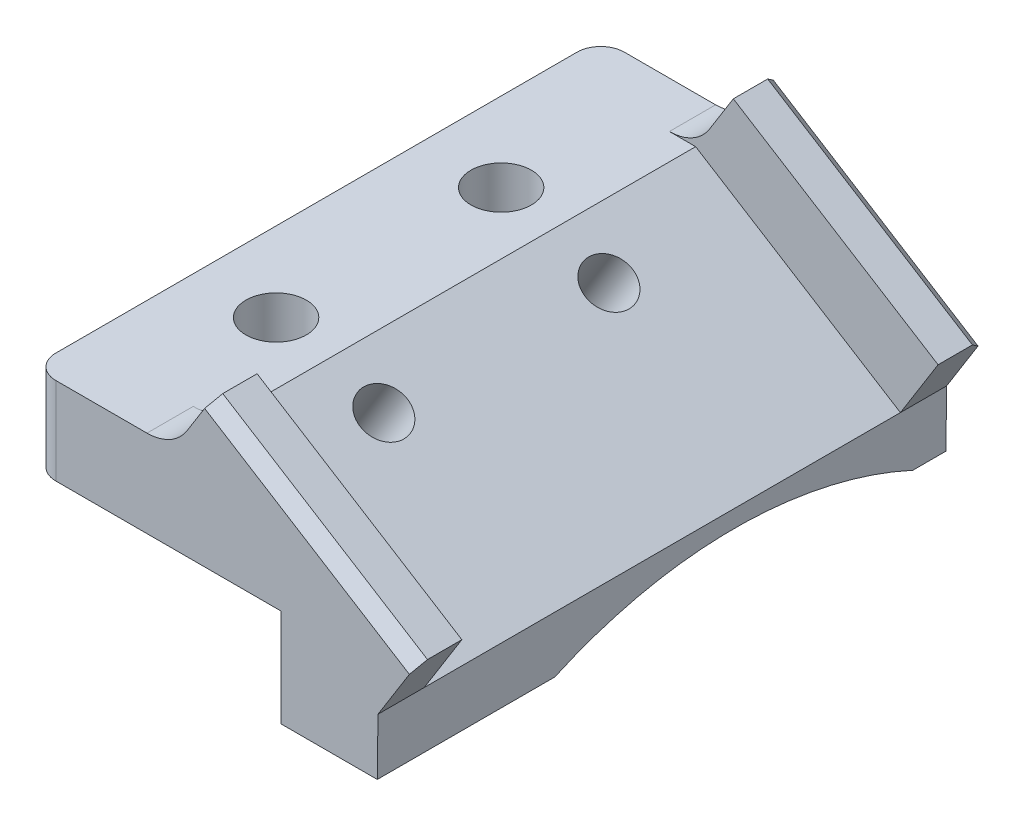
ISO-10303-21;
HEADER;
FILE_DESCRIPTION(('STEP AP214'),'2;1');
FILE_NAME('part.step','',(''),(''),'','','');
FILE_SCHEMA(('AUTOMOTIVE_DESIGN { 1 0 10303 214 1 1 1 1 }'));
ENDSEC;
DATA;
#1=APPLICATION_CONTEXT('core data for automotive mechanical design processes');
#2=APPLICATION_PROTOCOL_DEFINITION('international standard','automotive_design',2000,#1);
#3=PRODUCT_CONTEXT('',#1,'mechanical');
#4=PRODUCT('Part','Part','',(#3));
#5=PRODUCT_RELATED_PRODUCT_CATEGORY('part','',(#4));
#6=PRODUCT_DEFINITION_FORMATION('','',#4);
#7=PRODUCT_DEFINITION_CONTEXT('part definition',#1,'design');
#8=PRODUCT_DEFINITION('design','',#6,#7);
#9=PRODUCT_DEFINITION_SHAPE('','',#8);
#10=(LENGTH_UNIT() NAMED_UNIT(*) SI_UNIT(.MILLI.,.METRE.));
#11=(NAMED_UNIT(*) PLANE_ANGLE_UNIT() SI_UNIT($,.RADIAN.));
#12=(NAMED_UNIT(*) SI_UNIT($,.STERADIAN.) SOLID_ANGLE_UNIT());
#13=UNCERTAINTY_MEASURE_WITH_UNIT(LENGTH_MEASURE(1.E-05),#10,'distance_accuracy_value','');
#14=(GEOMETRIC_REPRESENTATION_CONTEXT(3) GLOBAL_UNCERTAINTY_ASSIGNED_CONTEXT((#13)) GLOBAL_UNIT_ASSIGNED_CONTEXT((#10,
#11,#12)) REPRESENTATION_CONTEXT('',''));
#15=CARTESIAN_POINT('',(0.,0.,0.));
#16=DIRECTION('',(0.,0.,1.));
#17=DIRECTION('',(1.,0.,0.));
#18=AXIS2_PLACEMENT_3D('',#15,#16,#17);
#19=CARTESIAN_POINT('',(-4.07097685037666,0.,24.));
#20=DIRECTION('',(0.,1.,0.));
#21=DIRECTION('',(0.,0.,1.));
#22=AXIS2_PLACEMENT_3D('',#19,#20,#21);
#23=PLANE('',#22);
#24=DIRECTION('',(0.,0.,-1.));
#25=VECTOR('',#24,1.);
#26=CARTESIAN_POINT('',(0.,0.,24.));
#27=LINE('',#26,#25);
#28=CARTESIAN_POINT('',(0.,0.,1.39553440509318));
#29=VERTEX_POINT('',#28);
#30=CARTESIAN_POINT('',(0.,0.,0.));
#31=VERTEX_POINT('',#30);
#32=EDGE_CURVE('E211',#29,#31,#27,.T.);
#33=ORIENTED_EDGE('',*,*,#32,.F.);
#34=CARTESIAN_POINT('',(-1337.31627510391,0.,8.94999999999999));
#35=DIRECTION('',(0.,1.,0.));
#36=DIRECTION('',(1.,0.,0.));
#37=AXIS2_PLACEMENT_3D('',#34,#35,#36);
#38=ELLIPSE('',#37,1473.35669717554,18.);
#39=CARTESIAN_POINT('',(-4.07097685037666,0.,1.28888903104086));
#40=VERTEX_POINT('',#39);
#41=EDGE_CURVE('E190',#29,#40,#38,.T.);
#42=ORIENTED_EDGE('',*,*,#41,.T.);
#43=DIRECTION('',(0.,0.,-1.));
#44=VECTOR('',#43,1.);
#45=CARTESIAN_POINT('',(-4.07097685037666,0.,24.));
#46=LINE('',#45,#44);
#47=CARTESIAN_POINT('',(-4.07097685037666,0.,0.));
#48=VERTEX_POINT('',#47);
#49=EDGE_CURVE('E335',#40,#48,#46,.T.);
#50=ORIENTED_EDGE('',*,*,#49,.T.);
#51=DIRECTION('',(1.,0.,0.));
#52=VECTOR('',#51,1.);
#53=CARTESIAN_POINT('',(-4.07097685037666,0.,0.));
#54=LINE('',#53,#52);
#55=EDGE_CURVE('E324',#48,#31,#54,.T.);
#56=ORIENTED_EDGE('',*,*,#55,.T.);
#57=EDGE_LOOP('',(#33,#42,#50,#56));
#58=FACE_BOUND('',#57,.T.);
#59=ADVANCED_FACE('F36',(#58),#23,.F.);
#60=CARTESIAN_POINT('',(0.0293229903893053,2.4,24.));
#61=DIRECTION('',(-0.529919264233203,-0.848048096156427,0.));
#62=DIRECTION('',(0.848048096156427,-0.529919264233203,0.));
#63=AXIS2_PLACEMENT_3D('',#60,#61,#62);
#64=PLANE('',#63);
#65=CARTESIAN_POINT('',(-6.67376729217509,6.5885556806557,17.05));
#66=DIRECTION('',(-0.529919264233203,-0.848048096156427,0.));
#67=DIRECTION('',(0.848048096156427,-0.529919264233203,0.));
#68=AXIS2_PLACEMENT_3D('',#65,#66,#67);
#69=CIRCLE('',#68,1.);
#70=CARTESIAN_POINT('',(-5.82571919601866,6.0586364164225,17.05));
#71=VERTEX_POINT('',#70);
#72=EDGE_CURVE('E270',#71,#71,#69,.T.);
#73=ORIENTED_EDGE('',*,*,#72,.T.);
#74=EDGE_LOOP('',(#73));
#75=FACE_BOUND('',#74,.T.);
#76=CARTESIAN_POINT('',(-6.67376729217509,6.58855568065571,7.54999999999999));
#77=DIRECTION('',(-0.529919264233203,-0.848048096156427,0.));
#78=DIRECTION('',(0.848048096156427,-0.529919264233203,0.));
#79=AXIS2_PLACEMENT_3D('',#76,#77,#78);
#80=CIRCLE('',#79,1.);
#81=CARTESIAN_POINT('',(-5.82571919601866,6.0586364164225,7.54999999999999));
#82=VERTEX_POINT('',#81);
#83=EDGE_CURVE('E266',#82,#82,#80,.T.);
#84=ORIENTED_EDGE('',*,*,#83,.T.);
#85=EDGE_LOOP('',(#84));
#86=FACE_BOUND('',#85,.T.);
#87=DIRECTION('',(-0.848048096156427,0.529919264233203,0.));
#88=VECTOR('',#87,1.);
#89=CARTESIAN_POINT('',(-8.6124834664324,7.79999999999999,22.05));
#90=LINE('',#89,#88);
#91=CARTESIAN_POINT('',(0.0293229903893053,2.4,22.05));
#92=VERTEX_POINT('',#91);
#93=CARTESIAN_POINT('',(-8.6124834664324,7.79999999999999,22.05));
#94=VERTEX_POINT('',#93);
#95=EDGE_CURVE('E373',#92,#94,#90,.T.);
#96=ORIENTED_EDGE('',*,*,#95,.F.);
#97=DIRECTION('',(0.,0.,-1.));
#98=VECTOR('',#97,1.);
#99=CARTESIAN_POINT('',(0.0293229903893053,2.4,24.));
#100=LINE('',#99,#98);
#101=CARTESIAN_POINT('',(0.0293229903893053,2.4,1.95));
#102=VERTEX_POINT('',#101);
#103=EDGE_CURVE('E355',#92,#102,#100,.T.);
#104=ORIENTED_EDGE('',*,*,#103,.T.);
#105=DIRECTION('',(0.848048096156427,-0.529919264233203,0.));
#106=VECTOR('',#105,1.);
#107=CARTESIAN_POINT('',(-8.6124834664324,7.8,1.95));
#108=LINE('',#107,#106);
#109=CARTESIAN_POINT('',(-8.6124834664324,7.8,1.95));
#110=VERTEX_POINT('',#109);
#111=EDGE_CURVE('E386',#110,#102,#108,.T.);
#112=ORIENTED_EDGE('',*,*,#111,.F.);
#113=DIRECTION('',(0.,0.,-1.));
#114=VECTOR('',#113,1.);
#115=CARTESIAN_POINT('',(-8.6124834664324,7.8,24.));
#116=LINE('',#115,#114);
#117=EDGE_CURVE('E295',#94,#110,#116,.T.);
#118=ORIENTED_EDGE('',*,*,#117,.F.);
#119=EDGE_LOOP('',(#96,#104,#112,#118));
#120=FACE_BOUND('',#119,.T.);
#121=ADVANCED_FACE('F378',(#75,#86,#120),#64,.F.);
#122=CARTESIAN_POINT('',(-4.07097685037666,0.,24.));
#123=VERTEX_POINT('',#122);
#124=CARTESIAN_POINT('',(-4.07097685037666,0.,16.6111109689591));
#125=VERTEX_POINT('',#124);
#126=EDGE_CURVE('E203',#123,#125,#46,.T.);
#127=ORIENTED_EDGE('',*,*,#126,.T.);
#128=CARTESIAN_POINT('',(0.,0.,16.5044655949068));
#129=VERTEX_POINT('',#128);
#130=EDGE_CURVE('E187',#125,#129,#38,.T.);
#131=ORIENTED_EDGE('',*,*,#130,.T.);
#132=CARTESIAN_POINT('',(0.,0.,24.));
#133=VERTEX_POINT('',#132);
#134=EDGE_CURVE('E201',#133,#129,#27,.T.);
#135=ORIENTED_EDGE('',*,*,#134,.F.);
#136=DIRECTION('',(1.,0.,0.));
#137=VECTOR('',#136,1.);
#138=CARTESIAN_POINT('',(-4.07097685037666,0.,24.));
#139=LINE('',#138,#137);
#140=EDGE_CURVE('E325',#123,#133,#139,.T.);
#141=ORIENTED_EDGE('',*,*,#140,.F.);
#142=EDGE_LOOP('',(#127,#131,#135,#141));
#143=FACE_BOUND('',#142,.T.);
#144=ADVANCED_FACE('F199',(#143),#23,.F.);
#145=CARTESIAN_POINT('',(0.,0.,24.));
#146=DIRECTION('',(-0.999925369660452,0.01221700083524,0.));
#147=DIRECTION('',(-0.01221700083524,-0.999925369660452,0.));
#148=AXIS2_PLACEMENT_3D('',#145,#146,#147);
#149=PLANE('',#148);
#150=ORIENTED_EDGE('',*,*,#134,.T.);
#151=CARTESIAN_POINT('',(-0.199601286954074,-16.3367747398811,8.94999999999999));
#152=DIRECTION('',(0.999925369660452,-0.01221700083524,0.));
#153=DIRECTION('',(0.01221700083524,0.999925369660452,0.));
#154=AXIS2_PLACEMENT_3D('',#151,#152,#153);
#155=CIRCLE('',#154,18.);
#156=EDGE_CURVE('E184',#29,#129,#155,.T.);
#157=ORIENTED_EDGE('',*,*,#156,.F.);
#158=ORIENTED_EDGE('',*,*,#32,.T.);
#159=DIRECTION('',(0.01221700083524,0.999925369660452,0.));
#160=VECTOR('',#159,1.);
#161=CARTESIAN_POINT('',(0.,0.,0.));
#162=LINE('',#161,#160);
#163=CARTESIAN_POINT('',(0.0293229903893053,2.4,0.));
#164=VERTEX_POINT('',#163);
#165=EDGE_CURVE('E338',#31,#164,#162,.T.);
#166=ORIENTED_EDGE('',*,*,#165,.T.);
#167=DIRECTION('',(0.,0.,-1.));
#168=VECTOR('',#167,1.);
#169=CARTESIAN_POINT('',(0.0293229903893053,2.4,0.));
#170=LINE('',#169,#168);
#171=EDGE_CURVE('E318',#102,#164,#170,.T.);
#172=ORIENTED_EDGE('',*,*,#171,.F.);
#173=ORIENTED_EDGE('',*,*,#103,.F.);
#174=CARTESIAN_POINT('',(0.0293229903893053,2.4,24.));
#175=VERTEX_POINT('',#174);
#176=EDGE_CURVE('E215',#175,#92,#100,.T.);
#177=ORIENTED_EDGE('',*,*,#176,.F.);
#178=DIRECTION('',(0.01221700083524,0.999925369660452,0.));
#179=VECTOR('',#178,1.);
#180=CARTESIAN_POINT('',(0.,0.,24.));
#181=LINE('',#180,#179);
#182=EDGE_CURVE('E208',#133,#175,#181,.T.);
#183=ORIENTED_EDGE('',*,*,#182,.F.);
#184=EDGE_LOOP('',(#150,#157,#158,#166,#172,#173,#177,#183));
#185=FACE_BOUND('',#184,.T.);
#186=ADVANCED_FACE('F205',(#185),#149,.F.);
#187=CARTESIAN_POINT('',(-8.6124834664324,7.8,24.));
#188=DIRECTION('',(0.,-1.,0.));
#189=DIRECTION('',(1.,0.,0.));
#190=AXIS2_PLACEMENT_3D('',#187,#188,#189);
#191=PLANE('',#190);
#192=CARTESIAN_POINT('',(-11.2209768503767,7.8,17.05));
#193=DIRECTION('',(0.,1.,0.));
#194=DIRECTION('',(-1.,0.,0.));
#195=AXIS2_PLACEMENT_3D('',#192,#193,#194);
#196=CIRCLE('',#195,1.275);
#197=CARTESIAN_POINT('',(-12.4959768503767,7.8,17.05));
#198=VERTEX_POINT('',#197);
#199=EDGE_CURVE('E260',#198,#198,#196,.T.);
#200=ORIENTED_EDGE('',*,*,#199,.F.);
#201=EDGE_LOOP('',(#200));
#202=FACE_BOUND('',#201,.T.);
#203=CARTESIAN_POINT('',(-11.2209768503767,7.8,7.54999999999999));
#204=DIRECTION('',(0.,1.,0.));
#205=DIRECTION('',(-1.,0.,0.));
#206=AXIS2_PLACEMENT_3D('',#203,#204,#205);
#207=CIRCLE('',#206,1.275);
#208=CARTESIAN_POINT('',(-12.4959768503767,7.8,7.54999999999999));
#209=VERTEX_POINT('',#208);
#210=EDGE_CURVE('E451',#209,#209,#207,.T.);
#211=ORIENTED_EDGE('',*,*,#210,.F.);
#212=EDGE_LOOP('',(#211));
#213=FACE_BOUND('',#212,.T.);
#214=DIRECTION('',(-1.,0.,0.));
#215=VECTOR('',#214,1.);
#216=CARTESIAN_POINT('',(-8.6124834664324,7.8,24.));
#217=LINE('',#216,#215);
#218=CARTESIAN_POINT('',(-9.72110156933794,7.8,24.));
#219=VERTEX_POINT('',#218);
#220=CARTESIAN_POINT('',(-13.5709768503767,7.8,24.));
#221=VERTEX_POINT('',#220);
#222=EDGE_CURVE('E329',#219,#221,#217,.T.);
#223=ORIENTED_EDGE('',*,*,#222,.F.);
#224=DIRECTION('',(0.,0.,-1.));
#225=VECTOR('',#224,1.);
#226=CARTESIAN_POINT('',(-9.72110156933794,7.8,22.05));
#227=LINE('',#226,#225);
#228=CARTESIAN_POINT('',(-9.72110156933794,7.8,22.05));
#229=VERTEX_POINT('',#228);
#230=EDGE_CURVE('E275',#219,#229,#227,.T.);
#231=ORIENTED_EDGE('',*,*,#230,.T.);
#232=DIRECTION('',(1.,0.,0.));
#233=VECTOR('',#232,1.);
#234=CARTESIAN_POINT('',(-7.02272567373279,7.8,22.05));
#235=LINE('',#234,#233);
#236=EDGE_CURVE('E273',#229,#94,#235,.T.);
#237=ORIENTED_EDGE('',*,*,#236,.T.);
#238=ORIENTED_EDGE('',*,*,#117,.T.);
#239=DIRECTION('',(-1.,0.,0.));
#240=VECTOR('',#239,1.);
#241=CARTESIAN_POINT('',(-7.02272567373279,7.8,1.95));
#242=LINE('',#241,#240);
#243=CARTESIAN_POINT('',(-9.72110156933794,7.8,1.95));
#244=VERTEX_POINT('',#243);
#245=EDGE_CURVE('E51',#110,#244,#242,.T.);
#246=ORIENTED_EDGE('',*,*,#245,.T.);
#247=DIRECTION('',(0.,0.,1.));
#248=VECTOR('',#247,1.);
#249=CARTESIAN_POINT('',(-9.72110156933794,7.8,0.));
#250=LINE('',#249,#248);
#251=CARTESIAN_POINT('',(-9.72110156933794,7.8,0.));
#252=VERTEX_POINT('',#251);
#253=EDGE_CURVE('E256',#244,#252,#250,.F.);
#254=ORIENTED_EDGE('',*,*,#253,.T.);
#255=DIRECTION('',(-1.,0.,0.));
#256=VECTOR('',#255,1.);
#257=CARTESIAN_POINT('',(-8.6124834664324,7.8,0.));
#258=LINE('',#257,#256);
#259=CARTESIAN_POINT('',(-13.5709768503767,7.8,0.));
#260=VERTEX_POINT('',#259);
#261=EDGE_CURVE('E305',#252,#260,#258,.T.);
#262=ORIENTED_EDGE('',*,*,#261,.T.);
#263=CARTESIAN_POINT('',(-13.5709768503767,7.8,1.));
#264=DIRECTION('',(0.,-1.,0.));
#265=DIRECTION('',(1.,0.,0.));
#266=AXIS2_PLACEMENT_3D('',#263,#264,#265);
#267=CIRCLE('',#266,1.);
#268=CARTESIAN_POINT('',(-14.5709768503767,7.8,1.));
#269=VERTEX_POINT('',#268);
#270=EDGE_CURVE('E251',#260,#269,#267,.F.);
#271=ORIENTED_EDGE('',*,*,#270,.T.);
#272=DIRECTION('',(0.,0.,-1.));
#273=VECTOR('',#272,1.);
#274=CARTESIAN_POINT('',(-14.5709768503767,7.8,24.));
#275=LINE('',#274,#273);
#276=CARTESIAN_POINT('',(-14.5709768503767,7.8,23.));
#277=VERTEX_POINT('',#276);
#278=EDGE_CURVE('E353',#277,#269,#275,.T.);
#279=ORIENTED_EDGE('',*,*,#278,.F.);
#280=CARTESIAN_POINT('',(-13.5709768503767,7.8,23.));
#281=DIRECTION('',(0.,-1.,0.));
#282=DIRECTION('',(1.,0.,0.));
#283=AXIS2_PLACEMENT_3D('',#280,#281,#282);
#284=CIRCLE('',#283,1.);
#285=EDGE_CURVE('E248',#277,#221,#284,.F.);
#286=ORIENTED_EDGE('',*,*,#285,.T.);
#287=EDGE_LOOP('',(#223,#231,#237,#238,#246,#254,#262,#271,#279,#286));
#288=FACE_BOUND('',#287,.T.);
#289=ADVANCED_FACE('F292',(#202,#213,#288),#191,.F.);
#290=CARTESIAN_POINT('',(-14.5709768503767,7.8,24.));
#291=DIRECTION('',(1.,0.,0.));
#292=DIRECTION('',(0.,0.,-1.));
#293=AXIS2_PLACEMENT_3D('',#290,#291,#292);
#294=PLANE('',#293);
#295=ORIENTED_EDGE('',*,*,#278,.T.);
#296=DIRECTION('',(0.,-1.,0.));
#297=VECTOR('',#296,1.);
#298=CARTESIAN_POINT('',(-14.5709768503767,4.125,1.));
#299=LINE('',#298,#297);
#300=CARTESIAN_POINT('',(-14.5709768503767,4.125,1.));
#301=VERTEX_POINT('',#300);
#302=EDGE_CURVE('E238',#269,#301,#299,.T.);
#303=ORIENTED_EDGE('',*,*,#302,.T.);
#304=DIRECTION('',(0.,0.,-1.));
#305=VECTOR('',#304,1.);
#306=CARTESIAN_POINT('',(-14.5709768503767,4.125,24.));
#307=LINE('',#306,#305);
#308=CARTESIAN_POINT('',(-14.5709768503767,4.125,23.));
#309=VERTEX_POINT('',#308);
#310=EDGE_CURVE('E350',#309,#301,#307,.T.);
#311=ORIENTED_EDGE('',*,*,#310,.F.);
#312=DIRECTION('',(0.,-1.,0.));
#313=VECTOR('',#312,1.);
#314=CARTESIAN_POINT('',(-14.5709768503767,7.8,23.));
#315=LINE('',#314,#313);
#316=EDGE_CURVE('E236',#309,#277,#315,.F.);
#317=ORIENTED_EDGE('',*,*,#316,.T.);
#318=EDGE_LOOP('',(#295,#303,#311,#317));
#319=FACE_BOUND('',#318,.T.);
#320=ADVANCED_FACE('F414',(#319),#294,.F.);
#321=CARTESIAN_POINT('',(-14.5709768503767,4.125,24.));
#322=DIRECTION('',(0.,1.,0.));
#323=DIRECTION('',(0.,0.,1.));
#324=AXIS2_PLACEMENT_3D('',#321,#322,#323);
#325=PLANE('',#324);
#326=CARTESIAN_POINT('',(-8.21316773373896,4.125,17.05));
#327=DIRECTION('',(0.,1.,0.));
#328=DIRECTION('',(1.,0.,0.));
#329=AXIS2_PLACEMENT_3D('',#326,#327,#328);
#330=ELLIPSE('',#329,1.1791784033621,1.);
#331=CARTESIAN_POINT('',(-7.03398933037686,4.125,17.05));
#332=VERTEX_POINT('',#331);
#333=EDGE_CURVE('E267',#332,#332,#330,.T.);
#334=ORIENTED_EDGE('',*,*,#333,.T.);
#335=EDGE_LOOP('',(#334));
#336=FACE_BOUND('',#335,.T.);
#337=CARTESIAN_POINT('',(-8.21316773373896,4.125,7.54999999999999));
#338=DIRECTION('',(0.,1.,0.));
#339=DIRECTION('',(1.,0.,0.));
#340=AXIS2_PLACEMENT_3D('',#337,#338,#339);
#341=ELLIPSE('',#340,1.1791784033621,1.);
#342=CARTESIAN_POINT('',(-7.03398933037686,4.125,7.54999999999999));
#343=VERTEX_POINT('',#342);
#344=EDGE_CURVE('E263',#343,#343,#341,.T.);
#345=ORIENTED_EDGE('',*,*,#344,.T.);
#346=EDGE_LOOP('',(#345));
#347=FACE_BOUND('',#346,.T.);
#348=CARTESIAN_POINT('',(-11.2209768503767,4.125,17.05));
#349=DIRECTION('',(0.,1.,0.));
#350=DIRECTION('',(0.,0.,1.));
#351=AXIS2_PLACEMENT_3D('',#348,#349,#350);
#352=CIRCLE('',#351,1.275);
#353=CARTESIAN_POINT('',(-11.2209768503767,4.125,18.325));
#354=VERTEX_POINT('',#353);
#355=EDGE_CURVE('E194',#354,#354,#352,.T.);
#356=ORIENTED_EDGE('',*,*,#355,.T.);
#357=EDGE_LOOP('',(#356));
#358=FACE_BOUND('',#357,.T.);
#359=CARTESIAN_POINT('',(-11.2209768503767,4.125,7.54999999999999));
#360=DIRECTION('',(0.,1.,0.));
#361=DIRECTION('',(0.,0.,1.));
#362=AXIS2_PLACEMENT_3D('',#359,#360,#361);
#363=CIRCLE('',#362,1.275);
#364=CARTESIAN_POINT('',(-11.2209768503767,4.125,8.82499999999999));
#365=VERTEX_POINT('',#364);
#366=EDGE_CURVE('E257',#365,#365,#363,.T.);
#367=ORIENTED_EDGE('',*,*,#366,.T.);
#368=EDGE_LOOP('',(#367));
#369=FACE_BOUND('',#368,.T.);
#370=ORIENTED_EDGE('',*,*,#310,.T.);
#371=CARTESIAN_POINT('',(-13.5709768503767,4.125,1.));
#372=DIRECTION('',(0.,1.,0.));
#373=DIRECTION('',(0.,0.,1.));
#374=AXIS2_PLACEMENT_3D('',#371,#372,#373);
#375=CIRCLE('',#374,1.);
#376=CARTESIAN_POINT('',(-13.5709768503767,4.125,0.));
#377=VERTEX_POINT('',#376);
#378=EDGE_CURVE('E243',#301,#377,#375,.F.);
#379=ORIENTED_EDGE('',*,*,#378,.T.);
#380=DIRECTION('',(1.,0.,0.));
#381=VECTOR('',#380,1.);
#382=CARTESIAN_POINT('',(-14.5709768503767,4.125,0.));
#383=LINE('',#382,#381);
#384=CARTESIAN_POINT('',(-4.07097685037666,4.125,0.));
#385=VERTEX_POINT('',#384);
#386=EDGE_CURVE('E342',#377,#385,#383,.T.);
#387=ORIENTED_EDGE('',*,*,#386,.T.);
#388=DIRECTION('',(0.,0.,-1.));
#389=VECTOR('',#388,1.);
#390=CARTESIAN_POINT('',(-4.07097685037666,4.125,24.));
#391=LINE('',#390,#389);
#392=CARTESIAN_POINT('',(-4.07097685037666,4.125,24.));
#393=VERTEX_POINT('',#392);
#394=EDGE_CURVE('E347',#393,#385,#391,.T.);
#395=ORIENTED_EDGE('',*,*,#394,.F.);
#396=DIRECTION('',(1.,0.,0.));
#397=VECTOR('',#396,1.);
#398=CARTESIAN_POINT('',(-14.5709768503767,4.125,24.));
#399=LINE('',#398,#397);
#400=CARTESIAN_POINT('',(-13.5709768503767,4.125,24.));
#401=VERTEX_POINT('',#400);
#402=EDGE_CURVE('E331',#401,#393,#399,.T.);
#403=ORIENTED_EDGE('',*,*,#402,.F.);
#404=CARTESIAN_POINT('',(-13.5709768503767,4.125,23.));
#405=DIRECTION('',(0.,1.,0.));
#406=DIRECTION('',(0.,0.,1.));
#407=AXIS2_PLACEMENT_3D('',#404,#405,#406);
#408=CIRCLE('',#407,1.);
#409=EDGE_CURVE('E241',#401,#309,#408,.F.);
#410=ORIENTED_EDGE('',*,*,#409,.T.);
#411=EDGE_LOOP('',(#370,#379,#387,#395,#403,#410));
#412=FACE_BOUND('',#411,.T.);
#413=ADVANCED_FACE('F499',(#336,#347,#358,#369,#412),#325,.F.);
#414=CARTESIAN_POINT('',(-4.07097685037666,4.125,24.));
#415=DIRECTION('',(1.,0.,0.));
#416=DIRECTION('',(0.,1.,0.));
#417=AXIS2_PLACEMENT_3D('',#414,#415,#416);
#418=PLANE('',#417);
#419=ORIENTED_EDGE('',*,*,#49,.F.);
#420=CARTESIAN_POINT('',(-4.07097685037666,-16.2894746113645,8.94999999999999));
#421=DIRECTION('',(1.,0.,0.));
#422=DIRECTION('',(0.,-1.,0.));
#423=AXIS2_PLACEMENT_3D('',#420,#421,#422);
#424=ELLIPSE('',#423,18.0013434463737,18.);
#425=EDGE_CURVE('E210',#40,#125,#424,.T.);
#426=ORIENTED_EDGE('',*,*,#425,.T.);
#427=ORIENTED_EDGE('',*,*,#126,.F.);
#428=DIRECTION('',(0.,-1.,0.));
#429=VECTOR('',#428,1.);
#430=CARTESIAN_POINT('',(-4.07097685037666,4.125,24.));
#431=LINE('',#430,#429);
#432=EDGE_CURVE('E333',#393,#123,#431,.T.);
#433=ORIENTED_EDGE('',*,*,#432,.F.);
#434=ORIENTED_EDGE('',*,*,#394,.T.);
#435=DIRECTION('',(0.,-1.,0.));
#436=VECTOR('',#435,1.);
#437=CARTESIAN_POINT('',(-4.07097685037666,4.125,0.));
#438=LINE('',#437,#436);
#439=EDGE_CURVE('E327',#385,#48,#438,.T.);
#440=ORIENTED_EDGE('',*,*,#439,.T.);
#441=EDGE_LOOP('',(#419,#426,#427,#433,#434,#440));
#442=FACE_BOUND('',#441,.T.);
#443=ADVANCED_FACE('F402',(#442),#418,.F.);
#444=CARTESIAN_POINT('',(0.,0.,24.));
#445=DIRECTION('',(0.,0.,-1.));
#446=DIRECTION('',(-1.,0.,0.));
#447=AXIS2_PLACEMENT_3D('',#444,#445,#446);
#448=PLANE('',#447);
#449=DIRECTION('',(-0.529919264233203,-0.848048096156427,0.));
#450=VECTOR('',#449,1.);
#451=CARTESIAN_POINT('',(-7.02272567373279,10.3441442884693,24.));
#452=LINE('',#451,#450);
#453=CARTESIAN_POINT('',(-7.2876853058494,9.92012024039106,24.));
#454=VERTEX_POINT('',#453);
#455=CARTESIAN_POINT('',(-8.02500537702509,8.74016147153359,24.));
#456=VERTEX_POINT('',#455);
#457=EDGE_CURVE('E389',#454,#456,#452,.T.);
#458=ORIENTED_EDGE('',*,*,#457,.T.);
#459=CARTESIAN_POINT('',(-9.72110156933794,9.8,24.));
#460=DIRECTION('',(0.,0.,-1.));
#461=DIRECTION('',(-1.,0.,0.));
#462=AXIS2_PLACEMENT_3D('',#459,#460,#461);
#463=CIRCLE('',#462,2.);
#464=EDGE_CURVE('E284',#456,#219,#463,.T.);
#465=ORIENTED_EDGE('',*,*,#464,.T.);
#466=ORIENTED_EDGE('',*,*,#222,.T.);
#467=DIRECTION('',(0.,-1.,0.));
#468=VECTOR('',#467,1.);
#469=CARTESIAN_POINT('',(-13.5709768503767,0.,24.));
#470=LINE('',#469,#468);
#471=EDGE_CURVE('E253',#221,#401,#470,.T.);
#472=ORIENTED_EDGE('',*,*,#471,.T.);
#473=ORIENTED_EDGE('',*,*,#402,.T.);
#474=ORIENTED_EDGE('',*,*,#432,.T.);
#475=ORIENTED_EDGE('',*,*,#140,.T.);
#476=ORIENTED_EDGE('',*,*,#182,.T.);
#477=DIRECTION('',(-0.529919264233203,-0.848048096156427,0.));
#478=VECTOR('',#477,1.);
#479=CARTESIAN_POINT('',(1.61908078308891,4.94414428846928,24.));
#480=LINE('',#479,#478);
#481=CARTESIAN_POINT('',(1.35412115097231,4.52012024039106,24.));
#482=VERTEX_POINT('',#481);
#483=EDGE_CURVE('E368',#482,#175,#480,.T.);
#484=ORIENTED_EDGE('',*,*,#483,.F.);
#485=DIRECTION('',(-0.848048096156427,0.529919264233203,0.));
#486=VECTOR('',#485,1.);
#487=CARTESIAN_POINT('',(2.41158533487453,3.85934328112876,24.));
#488=LINE('',#487,#486);
#489=EDGE_CURVE('E232',#482,#454,#488,.T.);
#490=ORIENTED_EDGE('',*,*,#489,.T.);
#491=EDGE_LOOP('',(#458,#465,#466,#472,#473,#474,#475,#476,#484,#490));
#492=FACE_BOUND('',#491,.T.);
#493=ADVANCED_FACE('F440',(#492),#448,.F.);
#494=CARTESIAN_POINT('',(0.,0.,0.));
#495=DIRECTION('',(0.,0.,-1.));
#496=DIRECTION('',(-1.,0.,0.));
#497=AXIS2_PLACEMENT_3D('',#494,#495,#496);
#498=PLANE('',#497);
#499=ORIENTED_EDGE('',*,*,#386,.F.);
#500=DIRECTION('',(0.,-1.,0.));
#501=VECTOR('',#500,1.);
#502=CARTESIAN_POINT('',(-13.5709768503767,7.8,0.));
#503=LINE('',#502,#501);
#504=EDGE_CURVE('E245',#377,#260,#503,.F.);
#505=ORIENTED_EDGE('',*,*,#504,.T.);
#506=ORIENTED_EDGE('',*,*,#261,.F.);
#507=CARTESIAN_POINT('',(-9.72110156933794,9.8,0.));
#508=DIRECTION('',(0.,0.,-1.));
#509=DIRECTION('',(-1.,0.,0.));
#510=AXIS2_PLACEMENT_3D('',#507,#508,#509);
#511=CIRCLE('',#510,2.);
#512=CARTESIAN_POINT('',(-8.02500537702509,8.74016147153359,0.));
#513=VERTEX_POINT('',#512);
#514=EDGE_CURVE('E11',#252,#513,#511,.F.);
#515=ORIENTED_EDGE('',*,*,#514,.T.);
#516=DIRECTION('',(-0.529919264233203,-0.848048096156427,0.));
#517=VECTOR('',#516,1.);
#518=CARTESIAN_POINT('',(-7.02272567373279,10.3441442884693,0.));
#519=LINE('',#518,#517);
#520=CARTESIAN_POINT('',(-7.2876853058494,9.92012024039106,0.));
#521=VERTEX_POINT('',#520);
#522=EDGE_CURVE('E303',#521,#513,#519,.T.);
#523=ORIENTED_EDGE('',*,*,#522,.F.);
#524=DIRECTION('',(0.848048096156427,-0.529919264233203,0.));
#525=VECTOR('',#524,1.);
#526=CARTESIAN_POINT('',(2.41158533487453,3.85934328112876,0.));
#527=LINE('',#526,#525);
#528=CARTESIAN_POINT('',(1.35412115097231,4.52012024039106,0.));
#529=VERTEX_POINT('',#528);
#530=EDGE_CURVE('E223',#521,#529,#527,.T.);
#531=ORIENTED_EDGE('',*,*,#530,.T.);
#532=DIRECTION('',(-0.529919264233203,-0.848048096156427,0.));
#533=VECTOR('',#532,1.);
#534=CARTESIAN_POINT('',(1.61908078308891,4.94414428846928,0.));
#535=LINE('',#534,#533);
#536=EDGE_CURVE('E309',#529,#164,#535,.T.);
#537=ORIENTED_EDGE('',*,*,#536,.T.);
#538=ORIENTED_EDGE('',*,*,#165,.F.);
#539=ORIENTED_EDGE('',*,*,#55,.F.);
#540=ORIENTED_EDGE('',*,*,#439,.F.);
#541=EDGE_LOOP('',(#499,#505,#506,#515,#523,#531,#537,#538,#539,#540));
#542=FACE_BOUND('',#541,.T.);
#543=ADVANCED_FACE('F302',(#542),#498,.T.);
#544=CARTESIAN_POINT('',(-7.02272567373279,10.3441442884693,0.));
#545=DIRECTION('',(0.848048096156427,-0.529919264233203,0.));
#546=DIRECTION('',(0.529919264233203,0.848048096156427,0.));
#547=AXIS2_PLACEMENT_3D('',#544,#545,#546);
#548=PLANE('',#547);
#549=ORIENTED_EDGE('',*,*,#522,.T.);
#550=DIRECTION('',(0.,0.,1.));
#551=VECTOR('',#550,1.);
#552=CARTESIAN_POINT('',(-8.02500537702509,8.74016147153359,1.95));
#553=LINE('',#552,#551);
#554=CARTESIAN_POINT('',(-8.02500537702509,8.74016147153359,1.95));
#555=VERTEX_POINT('',#554);
#556=EDGE_CURVE('E280',#513,#555,#553,.T.);
#557=ORIENTED_EDGE('',*,*,#556,.T.);
#558=DIRECTION('',(-0.529919264233203,-0.848048096156427,0.));
#559=VECTOR('',#558,1.);
#560=CARTESIAN_POINT('',(-7.02272567373279,10.3441442884693,1.95));
#561=LINE('',#560,#559);
#562=CARTESIAN_POINT('',(-7.02272567373279,10.3441442884693,1.95));
#563=VERTEX_POINT('',#562);
#564=EDGE_CURVE('E289',#563,#555,#561,.T.);
#565=ORIENTED_EDGE('',*,*,#564,.F.);
#566=DIRECTION('',(0.,0.,1.));
#567=VECTOR('',#566,1.);
#568=CARTESIAN_POINT('',(-7.02272567373279,10.3441442884693,0.));
#569=LINE('',#568,#567);
#570=CARTESIAN_POINT('',(-7.02272567373279,10.3441442884693,0.500000000000001));
#571=VERTEX_POINT('',#570);
#572=EDGE_CURVE('E385',#571,#563,#569,.T.);
#573=ORIENTED_EDGE('',*,*,#572,.F.);
#574=DIRECTION('',(0.374709505220685,0.599660559564554,0.707106781186544));
#575=VECTOR('',#574,1.);
#576=CARTESIAN_POINT('',(-7.02272567373279,10.3441442884693,0.500000000000001));
#577=LINE('',#576,#575);
#578=EDGE_CURVE('E221',#571,#521,#577,.F.);
#579=ORIENTED_EDGE('',*,*,#578,.T.);
#580=EDGE_LOOP('',(#549,#557,#565,#573,#579));
#581=FACE_BOUND('',#580,.T.);
#582=ADVANCED_FACE('F307',(#581),#548,.F.);
#583=CARTESIAN_POINT('',(-7.02272567373279,10.3441442884693,1.95));
#584=DIRECTION('',(0.,0.,-1.));
#585=DIRECTION('',(-1.,0.,0.));
#586=AXIS2_PLACEMENT_3D('',#583,#584,#585);
#587=PLANE('',#586);
#588=ORIENTED_EDGE('',*,*,#111,.T.);
#589=DIRECTION('',(-0.529919264233203,-0.848048096156427,0.));
#590=VECTOR('',#589,1.);
#591=CARTESIAN_POINT('',(1.61908078308891,4.94414428846928,1.95));
#592=LINE('',#591,#590);
#593=CARTESIAN_POINT('',(1.61908078308891,4.94414428846928,1.95));
#594=VERTEX_POINT('',#593);
#595=EDGE_CURVE('E312',#594,#102,#592,.T.);
#596=ORIENTED_EDGE('',*,*,#595,.F.);
#597=DIRECTION('',(0.848048096156427,-0.529919264233203,0.));
#598=VECTOR('',#597,1.);
#599=CARTESIAN_POINT('',(-7.02272567373279,10.3441442884693,1.95));
#600=LINE('',#599,#598);
#601=EDGE_CURVE('E315',#563,#594,#600,.T.);
#602=ORIENTED_EDGE('',*,*,#601,.F.);
#603=ORIENTED_EDGE('',*,*,#564,.T.);
#604=CARTESIAN_POINT('',(-9.72110156933794,9.8,1.95));
#605=DIRECTION('',(0.,0.,-1.));
#606=DIRECTION('',(-1.,0.,0.));
#607=AXIS2_PLACEMENT_3D('',#604,#605,#606);
#608=CIRCLE('',#607,2.);
#609=EDGE_CURVE('E44',#555,#244,#608,.T.);
#610=ORIENTED_EDGE('',*,*,#609,.T.);
#611=ORIENTED_EDGE('',*,*,#245,.F.);
#612=EDGE_LOOP('',(#588,#596,#602,#603,#610,#611));
#613=FACE_BOUND('',#612,.T.);
#614=ADVANCED_FACE('F286',(#613),#587,.F.);
#615=CARTESIAN_POINT('',(1.61908078308891,4.94414428846928,0.));
#616=DIRECTION('',(-0.848048096156427,0.529919264233203,0.));
#617=DIRECTION('',(-0.529919264233203,-0.848048096156427,0.));
#618=AXIS2_PLACEMENT_3D('',#615,#616,#617);
#619=PLANE('',#618);
#620=ORIENTED_EDGE('',*,*,#536,.F.);
#621=DIRECTION('',(-0.374709505220685,-0.599660559564554,-0.707106781186544));
#622=VECTOR('',#621,1.);
#623=CARTESIAN_POINT('',(1.61908078308891,4.94414428846928,0.500000000000001));
#624=LINE('',#623,#622);
#625=CARTESIAN_POINT('',(1.61908078308891,4.94414428846928,0.500000000000001));
#626=VERTEX_POINT('',#625);
#627=EDGE_CURVE('E225',#529,#626,#624,.F.);
#628=ORIENTED_EDGE('',*,*,#627,.T.);
#629=DIRECTION('',(0.,0.,-1.));
#630=VECTOR('',#629,1.);
#631=CARTESIAN_POINT('',(1.61908078308891,4.94414428846928,0.));
#632=LINE('',#631,#630);
#633=EDGE_CURVE('E310',#594,#626,#632,.T.);
#634=ORIENTED_EDGE('',*,*,#633,.F.);
#635=ORIENTED_EDGE('',*,*,#595,.T.);
#636=ORIENTED_EDGE('',*,*,#171,.T.);
#637=EDGE_LOOP('',(#620,#628,#634,#635,#636));
#638=FACE_BOUND('',#637,.T.);
#639=ADVANCED_FACE('F390',(#638),#619,.F.);
#640=CARTESIAN_POINT('',(2.67654496699114,4.28336732920698,0.));
#641=DIRECTION('',(0.529919264233203,0.848048096156427,0.));
#642=DIRECTION('',(-0.848048096156427,0.529919264233203,0.));
#643=AXIS2_PLACEMENT_3D('',#640,#641,#642);
#644=PLANE('',#643);
#645=ORIENTED_EDGE('',*,*,#633,.T.);
#646=DIRECTION('',(-0.848048096156427,0.529919264233203,0.));
#647=VECTOR('',#646,1.);
#648=CARTESIAN_POINT('',(2.67654496699114,4.28336732920698,0.500000000000001));
#649=LINE('',#648,#647);
#650=EDGE_CURVE('E213',#626,#571,#649,.T.);
#651=ORIENTED_EDGE('',*,*,#650,.T.);
#652=ORIENTED_EDGE('',*,*,#572,.T.);
#653=ORIENTED_EDGE('',*,*,#601,.T.);
#654=EDGE_LOOP('',(#645,#651,#652,#653));
#655=FACE_BOUND('',#654,.T.);
#656=ADVANCED_FACE('F394',(#655),#644,.T.);
#657=CARTESIAN_POINT('',(-7.02272567373279,10.3441442884693,24.));
#658=DIRECTION('',(0.848048096156427,-0.529919264233203,0.));
#659=DIRECTION('',(0.529919264233203,0.848048096156427,0.));
#660=AXIS2_PLACEMENT_3D('',#657,#658,#659);
#661=PLANE('',#660);
#662=DIRECTION('',(-0.529919264233203,-0.848048096156427,0.));
#663=VECTOR('',#662,1.);
#664=CARTESIAN_POINT('',(-7.02272567373279,10.3441442884693,22.05));
#665=LINE('',#664,#663);
#666=CARTESIAN_POINT('',(-7.02272567373279,10.3441442884693,22.05));
#667=VERTEX_POINT('',#666);
#668=CARTESIAN_POINT('',(-8.02500537702509,8.74016147153359,22.05));
#669=VERTEX_POINT('',#668);
#670=EDGE_CURVE('E376',#667,#669,#665,.T.);
#671=ORIENTED_EDGE('',*,*,#670,.T.);
#672=DIRECTION('',(0.,0.,-1.));
#673=VECTOR('',#672,1.);
#674=CARTESIAN_POINT('',(-8.02500537702509,8.74016147153359,24.));
#675=LINE('',#674,#673);
#676=EDGE_CURVE('E278',#669,#456,#675,.F.);
#677=ORIENTED_EDGE('',*,*,#676,.T.);
#678=ORIENTED_EDGE('',*,*,#457,.F.);
#679=DIRECTION('',(-0.374709505220688,-0.599660559564555,0.707106781186542));
#680=VECTOR('',#679,1.);
#681=CARTESIAN_POINT('',(-7.02272567373279,10.3441442884693,23.5));
#682=LINE('',#681,#680);
#683=CARTESIAN_POINT('',(-7.02272567373279,10.3441442884693,23.5));
#684=VERTEX_POINT('',#683);
#685=EDGE_CURVE('E234',#454,#684,#682,.F.);
#686=ORIENTED_EDGE('',*,*,#685,.T.);
#687=DIRECTION('',(0.,0.,1.));
#688=VECTOR('',#687,1.);
#689=CARTESIAN_POINT('',(-7.02272567373279,10.3441442884693,24.));
#690=LINE('',#689,#688);
#691=EDGE_CURVE('E379',#667,#684,#690,.T.);
#692=ORIENTED_EDGE('',*,*,#691,.F.);
#693=EDGE_LOOP('',(#671,#677,#678,#686,#692));
#694=FACE_BOUND('',#693,.T.);
#695=ADVANCED_FACE('F429',(#694),#661,.F.);
#696=CARTESIAN_POINT('',(1.61908078308891,4.94414428846928,24.));
#697=DIRECTION('',(-0.848048096156427,0.529919264233203,0.));
#698=DIRECTION('',(-0.529919264233203,-0.848048096156427,0.));
#699=AXIS2_PLACEMENT_3D('',#696,#697,#698);
#700=PLANE('',#699);
#701=DIRECTION('',(0.,0.,-1.));
#702=VECTOR('',#701,1.);
#703=CARTESIAN_POINT('',(1.61908078308891,4.94414428846928,24.));
#704=LINE('',#703,#702);
#705=CARTESIAN_POINT('',(1.61908078308891,4.94414428846928,23.5));
#706=VERTEX_POINT('',#705);
#707=CARTESIAN_POINT('',(1.61908078308891,4.94414428846928,22.05));
#708=VERTEX_POINT('',#707);
#709=EDGE_CURVE('E434',#706,#708,#704,.T.);
#710=ORIENTED_EDGE('',*,*,#709,.F.);
#711=DIRECTION('',(0.374709505220687,0.599660559564556,-0.707106781186542));
#712=VECTOR('',#711,1.);
#713=CARTESIAN_POINT('',(1.61908078308892,4.94414428846928,23.5));
#714=LINE('',#713,#712);
#715=EDGE_CURVE('E230',#706,#482,#714,.F.);
#716=ORIENTED_EDGE('',*,*,#715,.T.);
#717=ORIENTED_EDGE('',*,*,#483,.T.);
#718=ORIENTED_EDGE('',*,*,#176,.T.);
#719=DIRECTION('',(-0.529919264233203,-0.848048096156427,0.));
#720=VECTOR('',#719,1.);
#721=CARTESIAN_POINT('',(1.61908078308891,4.94414428846928,22.05));
#722=LINE('',#721,#720);
#723=EDGE_CURVE('E365',#708,#92,#722,.T.);
#724=ORIENTED_EDGE('',*,*,#723,.F.);
#725=EDGE_LOOP('',(#710,#716,#717,#718,#724));
#726=FACE_BOUND('',#725,.T.);
#727=ADVANCED_FACE('F364',(#726),#700,.F.);
#728=CARTESIAN_POINT('',(-7.02272567373279,10.3441442884693,22.05));
#729=DIRECTION('',(0.,0.,1.));
#730=DIRECTION('',(1.,0.,0.));
#731=AXIS2_PLACEMENT_3D('',#728,#729,#730);
#732=PLANE('',#731);
#733=ORIENTED_EDGE('',*,*,#95,.T.);
#734=ORIENTED_EDGE('',*,*,#236,.F.);
#735=CARTESIAN_POINT('',(-9.72110156933794,9.8,22.05));
#736=DIRECTION('',(0.,0.,1.));
#737=DIRECTION('',(1.,0.,0.));
#738=AXIS2_PLACEMENT_3D('',#735,#736,#737);
#739=CIRCLE('',#738,2.);
#740=EDGE_CURVE('E282',#229,#669,#739,.T.);
#741=ORIENTED_EDGE('',*,*,#740,.T.);
#742=ORIENTED_EDGE('',*,*,#670,.F.);
#743=DIRECTION('',(-0.848048096156427,0.529919264233203,0.));
#744=VECTOR('',#743,1.);
#745=CARTESIAN_POINT('',(-7.02272567373279,10.3441442884693,22.05));
#746=LINE('',#745,#744);
#747=EDGE_CURVE('E375',#708,#667,#746,.T.);
#748=ORIENTED_EDGE('',*,*,#747,.F.);
#749=ORIENTED_EDGE('',*,*,#723,.T.);
#750=EDGE_LOOP('',(#733,#734,#741,#742,#748,#749));
#751=FACE_BOUND('',#750,.T.);
#752=ADVANCED_FACE('F371',(#751),#732,.F.);
#753=CARTESIAN_POINT('',(2.67654496699113,4.28336732920697,0.));
#754=DIRECTION('',(-0.529919264233203,-0.848048096156427,0.));
#755=DIRECTION('',(0.848048096156427,-0.529919264233203,0.));
#756=AXIS2_PLACEMENT_3D('',#753,#754,#755);
#757=PLANE('',#756);
#758=ORIENTED_EDGE('',*,*,#691,.T.);
#759=DIRECTION('',(0.848048096156427,-0.529919264233203,0.));
#760=VECTOR('',#759,1.);
#761=CARTESIAN_POINT('',(2.67654496699114,4.28336732920698,23.5));
#762=LINE('',#761,#760);
#763=EDGE_CURVE('E227',#684,#706,#762,.T.);
#764=ORIENTED_EDGE('',*,*,#763,.T.);
#765=ORIENTED_EDGE('',*,*,#709,.T.);
#766=ORIENTED_EDGE('',*,*,#747,.T.);
#767=EDGE_LOOP('',(#758,#764,#765,#766));
#768=FACE_BOUND('',#767,.T.);
#769=ADVANCED_FACE('F447',(#768),#757,.F.);
#770=CARTESIAN_POINT('',(-14.894768332633,-16.1572304723604,8.94999999999999));
#771=DIRECTION('',(0.999925369660452,-0.01221700083524,0.));
#772=DIRECTION('',(0.01221700083524,0.999925369660452,0.));
#773=AXIS2_PLACEMENT_3D('',#770,#771,#772);
#774=CYLINDRICAL_SURFACE('',#773,18.);
#775=ORIENTED_EDGE('',*,*,#156,.T.);
#776=ORIENTED_EDGE('',*,*,#130,.F.);
#777=ORIENTED_EDGE('',*,*,#425,.F.);
#778=ORIENTED_EDGE('',*,*,#41,.F.);
#779=EDGE_LOOP('',(#775,#776,#777,#778));
#780=FACE_BOUND('',#779,.T.);
#781=ADVANCED_FACE('F186',(#780),#774,.F.);
#782=CARTESIAN_POINT('',(2.67654496699114,4.28336732920698,0.5));
#783=DIRECTION('',(-0.374709505220682,-0.599660559564548,0.707106781186551));
#784=DIRECTION('',(-0.848048096156427,0.529919264233203,0.));
#785=AXIS2_PLACEMENT_3D('',#782,#783,#784);
#786=PLANE('',#785);
#787=ORIENTED_EDGE('',*,*,#627,.F.);
#788=ORIENTED_EDGE('',*,*,#530,.F.);
#789=ORIENTED_EDGE('',*,*,#578,.F.);
#790=ORIENTED_EDGE('',*,*,#650,.F.);
#791=EDGE_LOOP('',(#787,#788,#789,#790));
#792=FACE_BOUND('',#791,.T.);
#793=ADVANCED_FACE('F396',(#792),#786,.F.);
#794=CARTESIAN_POINT('',(2.67654496699114,4.28336732920698,23.5));
#795=DIRECTION('',(-0.374709505220681,-0.599660559564546,-0.707106781186553));
#796=DIRECTION('',(0.848048096156427,-0.529919264233203,0.));
#797=AXIS2_PLACEMENT_3D('',#794,#795,#796);
#798=PLANE('',#797);
#799=ORIENTED_EDGE('',*,*,#685,.F.);
#800=ORIENTED_EDGE('',*,*,#489,.F.);
#801=ORIENTED_EDGE('',*,*,#715,.F.);
#802=ORIENTED_EDGE('',*,*,#763,.F.);
#803=EDGE_LOOP('',(#799,#800,#801,#802));
#804=FACE_BOUND('',#803,.T.);
#805=ADVANCED_FACE('F445',(#804),#798,.F.);
#806=CARTESIAN_POINT('',(-13.5709768503767,7.8,1.));
#807=DIRECTION('',(0.,1.,0.));
#808=DIRECTION('',(0.,0.,1.));
#809=AXIS2_PLACEMENT_3D('',#806,#807,#808);
#810=CYLINDRICAL_SURFACE('',#809,1.);
#811=ORIENTED_EDGE('',*,*,#270,.F.);
#812=ORIENTED_EDGE('',*,*,#504,.F.);
#813=ORIENTED_EDGE('',*,*,#378,.F.);
#814=ORIENTED_EDGE('',*,*,#302,.F.);
#815=EDGE_LOOP('',(#811,#812,#813,#814));
#816=FACE_BOUND('',#815,.T.);
#817=ADVANCED_FACE('F409',(#816),#810,.T.);
#818=CARTESIAN_POINT('',(-13.5709768503767,0.,23.));
#819=DIRECTION('',(0.,-1.,0.));
#820=DIRECTION('',(0.,0.,-1.));
#821=AXIS2_PLACEMENT_3D('',#818,#819,#820);
#822=CYLINDRICAL_SURFACE('',#821,1.);
#823=ORIENTED_EDGE('',*,*,#285,.F.);
#824=ORIENTED_EDGE('',*,*,#316,.F.);
#825=ORIENTED_EDGE('',*,*,#409,.F.);
#826=ORIENTED_EDGE('',*,*,#471,.F.);
#827=EDGE_LOOP('',(#823,#824,#825,#826));
#828=FACE_BOUND('',#827,.T.);
#829=ADVANCED_FACE('F418',(#828),#822,.T.);
#830=CARTESIAN_POINT('',(-11.2209768503767,0.,7.54999999999999));
#831=DIRECTION('',(0.,1.,0.));
#832=DIRECTION('',(-1.,0.,0.));
#833=AXIS2_PLACEMENT_3D('',#830,#831,#832);
#834=CYLINDRICAL_SURFACE('',#833,1.275);
#835=ORIENTED_EDGE('',*,*,#210,.T.);
#836=EDGE_LOOP('',(#835));
#837=FACE_BOUND('',#836,.T.);
#838=ORIENTED_EDGE('',*,*,#366,.F.);
#839=EDGE_LOOP('',(#838));
#840=FACE_BOUND('',#839,.T.);
#841=ADVANCED_FACE('F474',(#837,#840),#834,.F.);
#842=CARTESIAN_POINT('',(-11.2209768503767,0.,17.05));
#843=DIRECTION('',(0.,1.,0.));
#844=DIRECTION('',(-1.,0.,0.));
#845=AXIS2_PLACEMENT_3D('',#842,#843,#844);
#846=CYLINDRICAL_SURFACE('',#845,1.275);
#847=ORIENTED_EDGE('',*,*,#199,.T.);
#848=EDGE_LOOP('',(#847));
#849=FACE_BOUND('',#848,.T.);
#850=ORIENTED_EDGE('',*,*,#355,.F.);
#851=EDGE_LOOP('',(#850));
#852=FACE_BOUND('',#851,.T.);
#853=ADVANCED_FACE('F465',(#849,#852),#846,.F.);
#854=CARTESIAN_POINT('',(-11.8522949757866,-1.69882098102275,7.54999999999999));
#855=DIRECTION('',(0.529919264233203,0.848048096156427,0.));
#856=DIRECTION('',(-0.848048096156427,0.529919264233203,0.));
#857=AXIS2_PLACEMENT_3D('',#854,#855,#856);
#858=CYLINDRICAL_SURFACE('',#857,1.);
#859=ORIENTED_EDGE('',*,*,#344,.F.);
#860=EDGE_LOOP('',(#859));
#861=FACE_BOUND('',#860,.T.);
#862=ORIENTED_EDGE('',*,*,#83,.F.);
#863=EDGE_LOOP('',(#862));
#864=FACE_BOUND('',#863,.T.);
#865=ADVANCED_FACE('F462',(#861,#864),#858,.F.);
#866=CARTESIAN_POINT('',(-11.8522949757866,-1.69882098102275,17.05));
#867=DIRECTION('',(0.529919264233203,0.848048096156427,0.));
#868=DIRECTION('',(-0.848048096156427,0.529919264233203,0.));
#869=AXIS2_PLACEMENT_3D('',#866,#867,#868);
#870=CYLINDRICAL_SURFACE('',#869,1.);
#871=ORIENTED_EDGE('',*,*,#333,.F.);
#872=EDGE_LOOP('',(#871));
#873=FACE_BOUND('',#872,.T.);
#874=ORIENTED_EDGE('',*,*,#72,.F.);
#875=EDGE_LOOP('',(#874));
#876=FACE_BOUND('',#875,.T.);
#877=ADVANCED_FACE('F464',(#873,#876),#870,.F.);
#878=CARTESIAN_POINT('',(-9.72110156933794,9.8,24.));
#879=DIRECTION('',(0.,0.,1.));
#880=DIRECTION('',(1.,0.,0.));
#881=AXIS2_PLACEMENT_3D('',#878,#879,#880);
#882=CYLINDRICAL_SURFACE('',#881,2.);
#883=ORIENTED_EDGE('',*,*,#464,.F.);
#884=ORIENTED_EDGE('',*,*,#676,.F.);
#885=ORIENTED_EDGE('',*,*,#740,.F.);
#886=ORIENTED_EDGE('',*,*,#230,.F.);
#887=EDGE_LOOP('',(#883,#884,#885,#886));
#888=FACE_BOUND('',#887,.T.);
#889=ADVANCED_FACE('F424',(#888),#882,.F.);
#890=CARTESIAN_POINT('',(-9.72110156933794,9.8,0.));
#891=DIRECTION('',(0.,0.,-1.));
#892=DIRECTION('',(-1.,0.,0.));
#893=AXIS2_PLACEMENT_3D('',#890,#891,#892);
#894=CYLINDRICAL_SURFACE('',#893,2.);
#895=ORIENTED_EDGE('',*,*,#514,.F.);
#896=ORIENTED_EDGE('',*,*,#253,.F.);
#897=ORIENTED_EDGE('',*,*,#609,.F.);
#898=ORIENTED_EDGE('',*,*,#556,.F.);
#899=EDGE_LOOP('',(#895,#896,#897,#898));
#900=FACE_BOUND('',#899,.T.);
#901=ADVANCED_FACE('F38',(#900),#894,.F.);
#902=CLOSED_SHELL('',(#59,#121,#144,#186,#289,#320,#413,#443,#493,#543,#582,#614,#639,#656,#695,
#727,#752,#769,#781,#793,#805,#817,#829,#841,#853,#865,#877,#889,#901));
#903=MANIFOLD_SOLID_BREP('B2',#902);
#904=ADVANCED_BREP_SHAPE_REPRESENTATION('',(#18,#903),#14);
#905=SHAPE_DEFINITION_REPRESENTATION(#9,#904);
ENDSEC;
END-ISO-10303-21;
